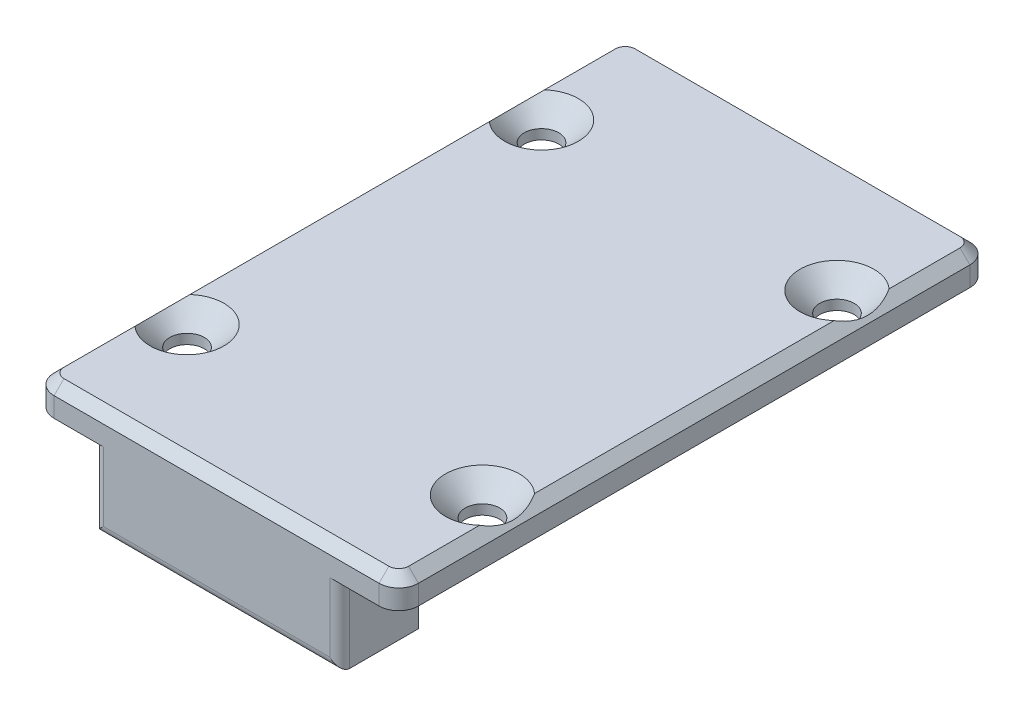
ISO-10303-21;
HEADER;
FILE_DESCRIPTION(('STEP AP214'),'2;1');
FILE_NAME('part.step','',(''),(''),'','','');
FILE_SCHEMA(('AUTOMOTIVE_DESIGN { 1 0 10303 214 1 1 1 1 }'));
ENDSEC;
DATA;
#1=APPLICATION_CONTEXT('core data for automotive mechanical design processes');
#2=APPLICATION_PROTOCOL_DEFINITION('international standard','automotive_design',2000,#1);
#3=PRODUCT_CONTEXT('',#1,'mechanical');
#4=PRODUCT('Part','Part','',(#3));
#5=PRODUCT_RELATED_PRODUCT_CATEGORY('part','',(#4));
#6=PRODUCT_DEFINITION_FORMATION('','',#4);
#7=PRODUCT_DEFINITION_CONTEXT('part definition',#1,'design');
#8=PRODUCT_DEFINITION('design','',#6,#7);
#9=PRODUCT_DEFINITION_SHAPE('','',#8);
#10=(LENGTH_UNIT() NAMED_UNIT(*) SI_UNIT(.MILLI.,.METRE.));
#11=(NAMED_UNIT(*) PLANE_ANGLE_UNIT() SI_UNIT($,.RADIAN.));
#12=(NAMED_UNIT(*) SI_UNIT($,.STERADIAN.) SOLID_ANGLE_UNIT());
#13=UNCERTAINTY_MEASURE_WITH_UNIT(LENGTH_MEASURE(1.E-05),#10,'distance_accuracy_value','');
#14=(GEOMETRIC_REPRESENTATION_CONTEXT(3) GLOBAL_UNCERTAINTY_ASSIGNED_CONTEXT((#13)) GLOBAL_UNIT_ASSIGNED_CONTEXT((#10,
#11,#12)) REPRESENTATION_CONTEXT('',''));
#15=CARTESIAN_POINT('',(0.,0.,0.));
#16=DIRECTION('',(0.,0.,1.));
#17=DIRECTION('',(1.,0.,0.));
#18=AXIS2_PLACEMENT_3D('',#15,#16,#17);
#19=CARTESIAN_POINT('',(18.5,3.,30.));
#20=DIRECTION('',(-1.,0.,0.));
#21=DIRECTION('',(0.,0.,1.));
#22=AXIS2_PLACEMENT_3D('',#19,#20,#21);
#23=PLANE('',#22);
#24=DIRECTION('',(0.,-1.,0.));
#25=VECTOR('',#24,1.);
#26=CARTESIAN_POINT('',(18.5,3.,-28.));
#27=LINE('',#26,#25);
#28=CARTESIAN_POINT('',(18.5,0.,-28.));
#29=VERTEX_POINT('',#28);
#30=CARTESIAN_POINT('',(18.5,1.99999999999999,-28.));
#31=VERTEX_POINT('',#30);
#32=EDGE_CURVE('E267',#29,#31,#27,.F.);
#33=ORIENTED_EDGE('',*,*,#32,.T.);
#34=DIRECTION('',(0.,0.,1.));
#35=VECTOR('',#34,1.);
#36=CARTESIAN_POINT('',(18.5,1.99999999999999,30.));
#37=LINE('',#36,#35);
#38=CARTESIAN_POINT('',(18.5,1.99999999999999,28.));
#39=VERTEX_POINT('',#38);
#40=EDGE_CURVE('E341',#31,#39,#37,.T.);
#41=ORIENTED_EDGE('',*,*,#40,.T.);
#42=DIRECTION('',(0.,-1.,0.));
#43=VECTOR('',#42,1.);
#44=CARTESIAN_POINT('',(18.5,3.,28.));
#45=LINE('',#44,#43);
#46=CARTESIAN_POINT('',(18.5,0.,28.));
#47=VERTEX_POINT('',#46);
#48=EDGE_CURVE('E265',#39,#47,#45,.T.);
#49=ORIENTED_EDGE('',*,*,#48,.T.);
#50=DIRECTION('',(0.,0.,-1.));
#51=VECTOR('',#50,1.);
#52=CARTESIAN_POINT('',(18.5,0.,30.));
#53=LINE('',#52,#51);
#54=EDGE_CURVE('E239',#47,#29,#53,.T.);
#55=ORIENTED_EDGE('',*,*,#54,.T.);
#56=EDGE_LOOP('',(#33,#41,#49,#55));
#57=FACE_BOUND('',#56,.T.);
#58=ADVANCED_FACE('F39',(#57),#23,.F.);
#59=CARTESIAN_POINT('',(-18.5,3.,-30.));
#60=DIRECTION('',(0.,0.,1.));
#61=DIRECTION('',(1.,0.,0.));
#62=AXIS2_PLACEMENT_3D('',#59,#60,#61);
#63=PLANE('',#62);
#64=DIRECTION('',(0.,-1.,0.));
#65=VECTOR('',#64,1.);
#66=CARTESIAN_POINT('',(-16.5,3.,-30.));
#67=LINE('',#66,#65);
#68=CARTESIAN_POINT('',(-16.5,0.,-30.));
#69=VERTEX_POINT('',#68);
#70=CARTESIAN_POINT('',(-16.5,1.99999999999999,-30.));
#71=VERTEX_POINT('',#70);
#72=EDGE_CURVE('E251',#69,#71,#67,.F.);
#73=ORIENTED_EDGE('',*,*,#72,.T.);
#74=DIRECTION('',(1.,0.,0.));
#75=VECTOR('',#74,1.);
#76=CARTESIAN_POINT('',(-18.5,2.,-30.));
#77=LINE('',#76,#75);
#78=CARTESIAN_POINT('',(16.5,1.99999999999999,-30.));
#79=VERTEX_POINT('',#78);
#80=EDGE_CURVE('E326',#71,#79,#77,.T.);
#81=ORIENTED_EDGE('',*,*,#80,.T.);
#82=DIRECTION('',(0.,-1.,0.));
#83=VECTOR('',#82,1.);
#84=CARTESIAN_POINT('',(16.5,3.,-30.));
#85=LINE('',#84,#83);
#86=CARTESIAN_POINT('',(16.5,0.,-30.));
#87=VERTEX_POINT('',#86);
#88=EDGE_CURVE('E254',#79,#87,#85,.T.);
#89=ORIENTED_EDGE('',*,*,#88,.T.);
#90=DIRECTION('',(-1.,0.,0.));
#91=VECTOR('',#90,1.);
#92=CARTESIAN_POINT('',(-18.5,0.,-30.));
#93=LINE('',#92,#91);
#94=EDGE_CURVE('E242',#87,#69,#93,.T.);
#95=ORIENTED_EDGE('',*,*,#94,.T.);
#96=EDGE_LOOP('',(#73,#81,#89,#95));
#97=FACE_BOUND('',#96,.T.);
#98=ADVANCED_FACE('F463',(#97),#63,.F.);
#99=CARTESIAN_POINT('',(-18.5,3.,30.));
#100=DIRECTION('',(1.,0.,0.));
#101=DIRECTION('',(0.,0.,-1.));
#102=AXIS2_PLACEMENT_3D('',#99,#100,#101);
#103=PLANE('',#102);
#104=DIRECTION('',(0.,-1.,0.));
#105=VECTOR('',#104,1.);
#106=CARTESIAN_POINT('',(-18.5,3.,28.));
#107=LINE('',#106,#105);
#108=CARTESIAN_POINT('',(-18.5,0.,28.));
#109=VERTEX_POINT('',#108);
#110=CARTESIAN_POINT('',(-18.5,1.99999999999999,28.));
#111=VERTEX_POINT('',#110);
#112=EDGE_CURVE('E270',#109,#111,#107,.F.);
#113=ORIENTED_EDGE('',*,*,#112,.T.);
#114=DIRECTION('',(0.,0.,-1.));
#115=VECTOR('',#114,1.);
#116=CARTESIAN_POINT('',(-18.5,1.99999999999999,30.));
#117=LINE('',#116,#115);
#118=CARTESIAN_POINT('',(-18.5,1.99999999999999,-28.));
#119=VERTEX_POINT('',#118);
#120=EDGE_CURVE('E329',#111,#119,#117,.T.);
#121=ORIENTED_EDGE('',*,*,#120,.T.);
#122=DIRECTION('',(0.,-1.,0.));
#123=VECTOR('',#122,1.);
#124=CARTESIAN_POINT('',(-18.5,3.,-28.));
#125=LINE('',#124,#123);
#126=CARTESIAN_POINT('',(-18.5,0.,-28.));
#127=VERTEX_POINT('',#126);
#128=EDGE_CURVE('E273',#119,#127,#125,.T.);
#129=ORIENTED_EDGE('',*,*,#128,.T.);
#130=DIRECTION('',(0.,0.,1.));
#131=VECTOR('',#130,1.);
#132=CARTESIAN_POINT('',(-18.5,0.,30.));
#133=LINE('',#132,#131);
#134=EDGE_CURVE('E245',#127,#109,#133,.T.);
#135=ORIENTED_EDGE('',*,*,#134,.T.);
#136=EDGE_LOOP('',(#113,#121,#129,#135));
#137=FACE_BOUND('',#136,.T.);
#138=ADVANCED_FACE('F469',(#137),#103,.F.);
#139=CARTESIAN_POINT('',(-18.5,3.,30.));
#140=DIRECTION('',(0.,0.,-1.));
#141=DIRECTION('',(-1.,0.,0.));
#142=AXIS2_PLACEMENT_3D('',#139,#140,#141);
#143=PLANE('',#142);
#144=DIRECTION('',(0.,-1.,0.));
#145=VECTOR('',#144,1.);
#146=CARTESIAN_POINT('',(16.5,3.,30.));
#147=LINE('',#146,#145);
#148=CARTESIAN_POINT('',(16.5,0.,30.));
#149=VERTEX_POINT('',#148);
#150=CARTESIAN_POINT('',(16.5,1.99999999999999,30.));
#151=VERTEX_POINT('',#150);
#152=EDGE_CURVE('E275',#149,#151,#147,.F.);
#153=ORIENTED_EDGE('',*,*,#152,.T.);
#154=DIRECTION('',(-1.,0.,0.));
#155=VECTOR('',#154,1.);
#156=CARTESIAN_POINT('',(-18.5,1.99999999999999,30.));
#157=LINE('',#156,#155);
#158=CARTESIAN_POINT('',(-16.5,1.99999999999999,30.));
#159=VERTEX_POINT('',#158);
#160=EDGE_CURVE('E335',#151,#159,#157,.T.);
#161=ORIENTED_EDGE('',*,*,#160,.T.);
#162=DIRECTION('',(0.,-1.,0.));
#163=VECTOR('',#162,1.);
#164=CARTESIAN_POINT('',(-16.5,3.,30.));
#165=LINE('',#164,#163);
#166=CARTESIAN_POINT('',(-16.5,0.,30.));
#167=VERTEX_POINT('',#166);
#168=EDGE_CURVE('E278',#159,#167,#165,.T.);
#169=ORIENTED_EDGE('',*,*,#168,.T.);
#170=DIRECTION('',(1.,0.,0.));
#171=VECTOR('',#170,1.);
#172=CARTESIAN_POINT('',(-18.5,0.,30.));
#173=LINE('',#172,#171);
#174=CARTESIAN_POINT('',(-11.5,0.,30.));
#175=VERTEX_POINT('',#174);
#176=EDGE_CURVE('E249',#167,#175,#173,.T.);
#177=ORIENTED_EDGE('',*,*,#176,.T.);
#178=DIRECTION('',(0.,1.,0.));
#179=VECTOR('',#178,1.);
#180=CARTESIAN_POINT('',(-11.5,3.,30.));
#181=LINE('',#180,#179);
#182=CARTESIAN_POINT('',(-11.5,-7.,30.));
#183=VERTEX_POINT('',#182);
#184=EDGE_CURVE('E287',#175,#183,#181,.F.);
#185=ORIENTED_EDGE('',*,*,#184,.T.);
#186=DIRECTION('',(-1.,0.,0.));
#187=VECTOR('',#186,1.);
#188=CARTESIAN_POINT('',(-18.5,-7.,30.));
#189=LINE('',#188,#187);
#190=CARTESIAN_POINT('',(11.5,-7.,30.));
#191=VERTEX_POINT('',#190);
#192=EDGE_CURVE('E285',#183,#191,#189,.F.);
#193=ORIENTED_EDGE('',*,*,#192,.T.);
#194=DIRECTION('',(0.,1.,0.));
#195=VECTOR('',#194,1.);
#196=CARTESIAN_POINT('',(11.5,3.,30.));
#197=LINE('',#196,#195);
#198=CARTESIAN_POINT('',(11.5,0.,30.));
#199=VERTEX_POINT('',#198);
#200=EDGE_CURVE('E282',#191,#199,#197,.T.);
#201=ORIENTED_EDGE('',*,*,#200,.T.);
#202=EDGE_CURVE('E248',#199,#149,#173,.T.);
#203=ORIENTED_EDGE('',*,*,#202,.T.);
#204=EDGE_LOOP('',(#153,#161,#169,#177,#185,#193,#201,#203));
#205=FACE_BOUND('',#204,.T.);
#206=ADVANCED_FACE('F542',(#205),#143,.F.);
#207=CARTESIAN_POINT('',(0.,3.,0.));
#208=DIRECTION('',(0.,-1.,0.));
#209=DIRECTION('',(0.,0.,-1.));
#210=AXIS2_PLACEMENT_3D('',#207,#208,#209);
#211=PLANE('',#210);
#212=DIRECTION('',(0.,0.,1.));
#213=VECTOR('',#212,1.);
#214=CARTESIAN_POINT('',(-17.5,3.,0.));
#215=LINE('',#214,#213);
#216=CARTESIAN_POINT('',(-17.5,3.,-15.2049150281253));
#217=VERTEX_POINT('',#216);
#218=CARTESIAN_POINT('',(-17.5,3.,15.2049150281253));
#219=VERTEX_POINT('',#218);
#220=EDGE_CURVE('E321',#217,#219,#215,.T.);
#221=ORIENTED_EDGE('',*,*,#220,.T.);
#222=CARTESIAN_POINT('',(-15.,3.,18.));
#223=DIRECTION('',(0.,-1.,0.));
#224=DIRECTION('',(0.,0.,-1.));
#225=AXIS2_PLACEMENT_3D('',#222,#223,#224);
#226=CIRCLE('',#225,3.75);
#227=CARTESIAN_POINT('',(-17.5,3.,20.7950849718747));
#228=VERTEX_POINT('',#227);
#229=EDGE_CURVE('E375',#219,#228,#226,.T.);
#230=ORIENTED_EDGE('',*,*,#229,.T.);
#231=CARTESIAN_POINT('',(-17.5,3.,28.));
#232=VERTEX_POINT('',#231);
#233=EDGE_CURVE('E316',#228,#232,#215,.T.);
#234=ORIENTED_EDGE('',*,*,#233,.T.);
#235=CARTESIAN_POINT('',(-16.5,3.,28.));
#236=DIRECTION('',(0.,-1.,0.));
#237=DIRECTION('',(0.,0.,-1.));
#238=AXIS2_PLACEMENT_3D('',#235,#236,#237);
#239=CIRCLE('',#238,0.999999999999994);
#240=CARTESIAN_POINT('',(-16.5,3.,29.));
#241=VERTEX_POINT('',#240);
#242=EDGE_CURVE('E314',#232,#241,#239,.F.);
#243=ORIENTED_EDGE('',*,*,#242,.T.);
#244=DIRECTION('',(1.,0.,0.));
#245=VECTOR('',#244,1.);
#246=CARTESIAN_POINT('',(0.,3.,29.));
#247=LINE('',#246,#245);
#248=CARTESIAN_POINT('',(16.5,3.,29.));
#249=VERTEX_POINT('',#248);
#250=EDGE_CURVE('E312',#241,#249,#247,.T.);
#251=ORIENTED_EDGE('',*,*,#250,.T.);
#252=CARTESIAN_POINT('',(16.5,3.,28.));
#253=DIRECTION('',(0.,-1.,0.));
#254=DIRECTION('',(0.,0.,-1.));
#255=AXIS2_PLACEMENT_3D('',#252,#253,#254);
#256=CIRCLE('',#255,0.99999999999999);
#257=CARTESIAN_POINT('',(17.5,3.,28.));
#258=VERTEX_POINT('',#257);
#259=EDGE_CURVE('E310',#249,#258,#256,.F.);
#260=ORIENTED_EDGE('',*,*,#259,.T.);
#261=DIRECTION('',(0.,0.,-1.));
#262=VECTOR('',#261,1.);
#263=CARTESIAN_POINT('',(17.5,3.,0.));
#264=LINE('',#263,#262);
#265=CARTESIAN_POINT('',(17.5,3.,20.7950849718747));
#266=VERTEX_POINT('',#265);
#267=EDGE_CURVE('E304',#258,#266,#264,.T.);
#268=ORIENTED_EDGE('',*,*,#267,.T.);
#269=CARTESIAN_POINT('',(15.,3.,18.));
#270=DIRECTION('',(0.,-1.,0.));
#271=DIRECTION('',(0.,0.,-1.));
#272=AXIS2_PLACEMENT_3D('',#269,#270,#271);
#273=CIRCLE('',#272,3.75);
#274=CARTESIAN_POINT('',(17.5,3.,15.2049150281253));
#275=VERTEX_POINT('',#274);
#276=EDGE_CURVE('E372',#266,#275,#273,.T.);
#277=ORIENTED_EDGE('',*,*,#276,.T.);
#278=CARTESIAN_POINT('',(17.5,3.,-15.2049150281253));
#279=VERTEX_POINT('',#278);
#280=EDGE_CURVE('E308',#275,#279,#264,.T.);
#281=ORIENTED_EDGE('',*,*,#280,.T.);
#282=CARTESIAN_POINT('',(15.,3.,-18.));
#283=DIRECTION('',(0.,-1.,0.));
#284=DIRECTION('',(0.,0.,-1.));
#285=AXIS2_PLACEMENT_3D('',#282,#283,#284);
#286=CIRCLE('',#285,3.75);
#287=CARTESIAN_POINT('',(17.5,3.,-20.7950849718747));
#288=VERTEX_POINT('',#287);
#289=EDGE_CURVE('E367',#279,#288,#286,.T.);
#290=ORIENTED_EDGE('',*,*,#289,.T.);
#291=CARTESIAN_POINT('',(17.5,3.,-28.));
#292=VERTEX_POINT('',#291);
#293=EDGE_CURVE('E297',#288,#292,#264,.T.);
#294=ORIENTED_EDGE('',*,*,#293,.T.);
#295=CARTESIAN_POINT('',(16.5,3.,-28.));
#296=DIRECTION('',(0.,-1.,0.));
#297=DIRECTION('',(0.,0.,-1.));
#298=AXIS2_PLACEMENT_3D('',#295,#296,#297);
#299=CIRCLE('',#298,0.999999999999994);
#300=CARTESIAN_POINT('',(16.5,3.,-29.));
#301=VERTEX_POINT('',#300);
#302=EDGE_CURVE('E307',#292,#301,#299,.F.);
#303=ORIENTED_EDGE('',*,*,#302,.T.);
#304=DIRECTION('',(-1.,0.,0.));
#305=VECTOR('',#304,1.);
#306=CARTESIAN_POINT('',(0.,3.,-29.));
#307=LINE('',#306,#305);
#308=CARTESIAN_POINT('',(-16.5,3.,-29.));
#309=VERTEX_POINT('',#308);
#310=EDGE_CURVE('E320',#301,#309,#307,.T.);
#311=ORIENTED_EDGE('',*,*,#310,.T.);
#312=CARTESIAN_POINT('',(-16.5,3.,-28.));
#313=DIRECTION('',(0.,-1.,0.));
#314=DIRECTION('',(0.,0.,-1.));
#315=AXIS2_PLACEMENT_3D('',#312,#313,#314);
#316=CIRCLE('',#315,0.99999999999999);
#317=CARTESIAN_POINT('',(-17.5,3.,-28.));
#318=VERTEX_POINT('',#317);
#319=EDGE_CURVE('E324',#309,#318,#316,.F.);
#320=ORIENTED_EDGE('',*,*,#319,.T.);
#321=CARTESIAN_POINT('',(-17.5,3.,-20.7950849718747));
#322=VERTEX_POINT('',#321);
#323=EDGE_CURVE('E317',#318,#322,#215,.T.);
#324=ORIENTED_EDGE('',*,*,#323,.T.);
#325=CARTESIAN_POINT('',(-15.,3.,-18.));
#326=DIRECTION('',(0.,-1.,0.));
#327=DIRECTION('',(0.,0.,-1.));
#328=AXIS2_PLACEMENT_3D('',#325,#326,#327);
#329=CIRCLE('',#328,3.75);
#330=EDGE_CURVE('E369',#322,#217,#329,.T.);
#331=ORIENTED_EDGE('',*,*,#330,.T.);
#332=EDGE_LOOP('',(#221,#230,#234,#243,#251,#260,#268,#277,#281,#290,#294,#303,#311,#320,#324,#331));
#333=FACE_BOUND('',#332,.T.);
#334=ADVANCED_FACE('F571',(#333),#211,.F.);
#335=CARTESIAN_POINT('',(0.,0.,0.));
#336=DIRECTION('',(0.,-1.,0.));
#337=DIRECTION('',(0.,0.,-1.));
#338=AXIS2_PLACEMENT_3D('',#335,#336,#337);
#339=PLANE('',#338);
#340=DIRECTION('',(0.,0.,1.));
#341=VECTOR('',#340,1.);
#342=CARTESIAN_POINT('',(12.5,0.,22.));
#343=LINE('',#342,#341);
#344=CARTESIAN_POINT('',(12.5,0.,22.));
#345=VERTEX_POINT('',#344);
#346=CARTESIAN_POINT('',(12.5,0.,29.));
#347=VERTEX_POINT('',#346);
#348=EDGE_CURVE('E221',#345,#347,#343,.T.);
#349=ORIENTED_EDGE('',*,*,#348,.F.);
#350=DIRECTION('',(1.,0.,0.));
#351=VECTOR('',#350,1.);
#352=CARTESIAN_POINT('',(-12.5,0.,22.));
#353=LINE('',#352,#351);
#354=CARTESIAN_POINT('',(-12.5,0.,22.));
#355=VERTEX_POINT('',#354);
#356=EDGE_CURVE('E226',#355,#345,#353,.T.);
#357=ORIENTED_EDGE('',*,*,#356,.F.);
#358=DIRECTION('',(0.,0.,-1.));
#359=VECTOR('',#358,1.);
#360=CARTESIAN_POINT('',(-12.5,0.,22.));
#361=LINE('',#360,#359);
#362=CARTESIAN_POINT('',(-12.5,0.,29.));
#363=VERTEX_POINT('',#362);
#364=EDGE_CURVE('E207',#363,#355,#361,.T.);
#365=ORIENTED_EDGE('',*,*,#364,.F.);
#366=CARTESIAN_POINT('',(-11.5,0.,29.));
#367=DIRECTION('',(0.,-1.,0.));
#368=DIRECTION('',(0.,0.,-1.));
#369=AXIS2_PLACEMENT_3D('',#366,#367,#368);
#370=CIRCLE('',#369,1.);
#371=EDGE_CURVE('E292',#363,#175,#370,.F.);
#372=ORIENTED_EDGE('',*,*,#371,.T.);
#373=ORIENTED_EDGE('',*,*,#176,.F.);
#374=CARTESIAN_POINT('',(-16.5,0.,28.));
#375=DIRECTION('',(0.,-1.,0.));
#376=DIRECTION('',(0.,0.,-1.));
#377=AXIS2_PLACEMENT_3D('',#374,#375,#376);
#378=CIRCLE('',#377,2.);
#379=EDGE_CURVE('E259',#167,#109,#378,.T.);
#380=ORIENTED_EDGE('',*,*,#379,.T.);
#381=ORIENTED_EDGE('',*,*,#134,.F.);
#382=CARTESIAN_POINT('',(-16.5,0.,-28.));
#383=DIRECTION('',(0.,-1.,0.));
#384=DIRECTION('',(0.,0.,-1.));
#385=AXIS2_PLACEMENT_3D('',#382,#383,#384);
#386=CIRCLE('',#385,2.);
#387=EDGE_CURVE('E261',#127,#69,#386,.T.);
#388=ORIENTED_EDGE('',*,*,#387,.T.);
#389=ORIENTED_EDGE('',*,*,#94,.F.);
#390=CARTESIAN_POINT('',(16.5,0.,-28.));
#391=DIRECTION('',(0.,-1.,0.));
#392=DIRECTION('',(0.,0.,-1.));
#393=AXIS2_PLACEMENT_3D('',#390,#391,#392);
#394=CIRCLE('',#393,2.);
#395=EDGE_CURVE('E263',#87,#29,#394,.T.);
#396=ORIENTED_EDGE('',*,*,#395,.T.);
#397=ORIENTED_EDGE('',*,*,#54,.F.);
#398=CARTESIAN_POINT('',(16.5,0.,28.));
#399=DIRECTION('',(0.,-1.,0.));
#400=DIRECTION('',(0.,0.,-1.));
#401=AXIS2_PLACEMENT_3D('',#398,#399,#400);
#402=CIRCLE('',#401,2.);
#403=EDGE_CURVE('E256',#47,#149,#402,.T.);
#404=ORIENTED_EDGE('',*,*,#403,.T.);
#405=ORIENTED_EDGE('',*,*,#202,.F.);
#406=CARTESIAN_POINT('',(11.5,0.,29.));
#407=DIRECTION('',(0.,-1.,0.));
#408=DIRECTION('',(0.,0.,-1.));
#409=AXIS2_PLACEMENT_3D('',#406,#407,#408);
#410=CIRCLE('',#409,1.);
#411=EDGE_CURVE('E295',#199,#347,#410,.F.);
#412=ORIENTED_EDGE('',*,*,#411,.T.);
#413=EDGE_LOOP('',(#349,#357,#365,#372,#373,#380,#381,#388,#389,#396,#397,#404,#405,#412));
#414=FACE_BOUND('',#413,.T.);
#415=CARTESIAN_POINT('',(-15.,0.,-18.));
#416=DIRECTION('',(0.,1.,0.));
#417=DIRECTION('',(0.,0.,-1.));
#418=AXIS2_PLACEMENT_3D('',#415,#416,#417);
#419=CIRCLE('',#418,1.75);
#420=CARTESIAN_POINT('',(-15.,0.,-19.75));
#421=VERTEX_POINT('',#420);
#422=EDGE_CURVE('E211',#421,#421,#419,.T.);
#423=ORIENTED_EDGE('',*,*,#422,.T.);
#424=EDGE_LOOP('',(#423));
#425=FACE_BOUND('',#424,.T.);
#426=CARTESIAN_POINT('',(-15.,0.,18.));
#427=DIRECTION('',(0.,1.,0.));
#428=DIRECTION('',(0.,0.,1.));
#429=AXIS2_PLACEMENT_3D('',#426,#427,#428);
#430=CIRCLE('',#429,1.75);
#431=CARTESIAN_POINT('',(-15.,0.,19.75));
#432=VERTEX_POINT('',#431);
#433=EDGE_CURVE('E232',#432,#432,#430,.T.);
#434=ORIENTED_EDGE('',*,*,#433,.T.);
#435=EDGE_LOOP('',(#434));
#436=FACE_BOUND('',#435,.T.);
#437=CARTESIAN_POINT('',(15.,0.,18.));
#438=DIRECTION('',(0.,1.,0.));
#439=DIRECTION('',(0.,0.,-1.));
#440=AXIS2_PLACEMENT_3D('',#437,#438,#439);
#441=CIRCLE('',#440,1.75);
#442=CARTESIAN_POINT('',(15.,0.,16.25));
#443=VERTEX_POINT('',#442);
#444=EDGE_CURVE('E228',#443,#443,#441,.T.);
#445=ORIENTED_EDGE('',*,*,#444,.T.);
#446=EDGE_LOOP('',(#445));
#447=FACE_BOUND('',#446,.T.);
#448=CARTESIAN_POINT('',(15.,0.,-18.));
#449=DIRECTION('',(0.,1.,0.));
#450=DIRECTION('',(0.,0.,1.));
#451=AXIS2_PLACEMENT_3D('',#448,#449,#450);
#452=CIRCLE('',#451,1.75);
#453=CARTESIAN_POINT('',(15.,0.,-16.25));
#454=VERTEX_POINT('',#453);
#455=EDGE_CURVE('E231',#454,#454,#452,.T.);
#456=ORIENTED_EDGE('',*,*,#455,.T.);
#457=EDGE_LOOP('',(#456));
#458=FACE_BOUND('',#457,.T.);
#459=ADVANCED_FACE('F548',(#414,#425,#436,#447,#458),#339,.T.);
#460=CARTESIAN_POINT('',(15.,0.,-18.));
#461=DIRECTION('',(0.,1.,0.));
#462=DIRECTION('',(0.,0.,1.));
#463=AXIS2_PLACEMENT_3D('',#460,#461,#462);
#464=CYLINDRICAL_SURFACE('',#463,1.75);
#465=CARTESIAN_POINT('',(15.,0.999999999999994,-18.));
#466=DIRECTION('',(0.,-1.,0.));
#467=DIRECTION('',(0.,0.,-1.));
#468=AXIS2_PLACEMENT_3D('',#465,#466,#467);
#469=CIRCLE('',#468,1.75);
#470=CARTESIAN_POINT('',(15.,0.999999999999994,-19.75));
#471=VERTEX_POINT('',#470);
#472=EDGE_CURVE('E11',#471,#471,#469,.F.);
#473=ORIENTED_EDGE('',*,*,#472,.T.);
#474=EDGE_LOOP('',(#473));
#475=FACE_BOUND('',#474,.T.);
#476=ORIENTED_EDGE('',*,*,#455,.F.);
#477=EDGE_LOOP('',(#476));
#478=FACE_BOUND('',#477,.T.);
#479=ADVANCED_FACE('F577',(#475,#478),#464,.F.);
#480=CARTESIAN_POINT('',(15.,0.,18.));
#481=DIRECTION('',(0.,1.,0.));
#482=DIRECTION('',(0.,0.,1.));
#483=AXIS2_PLACEMENT_3D('',#480,#481,#482);
#484=CYLINDRICAL_SURFACE('',#483,1.75);
#485=CARTESIAN_POINT('',(15.,0.999999999999994,18.));
#486=DIRECTION('',(0.,-1.,0.));
#487=DIRECTION('',(0.,0.,-1.));
#488=AXIS2_PLACEMENT_3D('',#485,#486,#487);
#489=CIRCLE('',#488,1.75);
#490=CARTESIAN_POINT('',(15.,0.999999999999994,16.25));
#491=VERTEX_POINT('',#490);
#492=EDGE_CURVE('E805',#491,#491,#489,.F.);
#493=ORIENTED_EDGE('',*,*,#492,.T.);
#494=EDGE_LOOP('',(#493));
#495=FACE_BOUND('',#494,.T.);
#496=ORIENTED_EDGE('',*,*,#444,.F.);
#497=EDGE_LOOP('',(#496));
#498=FACE_BOUND('',#497,.T.);
#499=ADVANCED_FACE('F580',(#495,#498),#484,.F.);
#500=CARTESIAN_POINT('',(-15.,0.,18.));
#501=DIRECTION('',(0.,1.,0.));
#502=DIRECTION('',(0.,0.,1.));
#503=AXIS2_PLACEMENT_3D('',#500,#501,#502);
#504=CYLINDRICAL_SURFACE('',#503,1.75);
#505=CARTESIAN_POINT('',(-15.,0.999999999999999,18.));
#506=DIRECTION('',(0.,-1.,0.));
#507=DIRECTION('',(0.,0.,-1.));
#508=AXIS2_PLACEMENT_3D('',#505,#506,#507);
#509=CIRCLE('',#508,1.75);
#510=CARTESIAN_POINT('',(-15.,0.999999999999999,16.25));
#511=VERTEX_POINT('',#510);
#512=EDGE_CURVE('E343',#511,#511,#509,.F.);
#513=ORIENTED_EDGE('',*,*,#512,.T.);
#514=EDGE_LOOP('',(#513));
#515=FACE_BOUND('',#514,.T.);
#516=ORIENTED_EDGE('',*,*,#433,.F.);
#517=EDGE_LOOP('',(#516));
#518=FACE_BOUND('',#517,.T.);
#519=ADVANCED_FACE('F609',(#515,#518),#504,.F.);
#520=CARTESIAN_POINT('',(-15.,0.,-18.));
#521=DIRECTION('',(0.,1.,0.));
#522=DIRECTION('',(0.,0.,1.));
#523=AXIS2_PLACEMENT_3D('',#520,#521,#522);
#524=CYLINDRICAL_SURFACE('',#523,1.75);
#525=CARTESIAN_POINT('',(-15.,0.999999999999999,-18.));
#526=DIRECTION('',(0.,-1.,0.));
#527=DIRECTION('',(0.,0.,-1.));
#528=AXIS2_PLACEMENT_3D('',#525,#526,#527);
#529=CIRCLE('',#528,1.75);
#530=CARTESIAN_POINT('',(-15.,0.999999999999999,-19.75));
#531=VERTEX_POINT('',#530);
#532=EDGE_CURVE('E49',#531,#531,#529,.F.);
#533=ORIENTED_EDGE('',*,*,#532,.T.);
#534=EDGE_LOOP('',(#533));
#535=FACE_BOUND('',#534,.T.);
#536=ORIENTED_EDGE('',*,*,#422,.F.);
#537=EDGE_LOOP('',(#536));
#538=FACE_BOUND('',#537,.T.);
#539=ADVANCED_FACE('F478',(#535,#538),#524,.F.);
#540=CARTESIAN_POINT('',(16.5,3.,-28.));
#541=DIRECTION('',(0.,-1.,0.));
#542=DIRECTION('',(0.,0.,-1.));
#543=AXIS2_PLACEMENT_3D('',#540,#541,#542);
#544=CYLINDRICAL_SURFACE('',#543,2.);
#545=ORIENTED_EDGE('',*,*,#88,.F.);
#546=CARTESIAN_POINT('',(16.5,1.99999999999999,-28.));
#547=DIRECTION('',(0.,-1.,0.));
#548=DIRECTION('',(0.,0.,-1.));
#549=AXIS2_PLACEMENT_3D('',#546,#547,#548);
#550=CIRCLE('',#549,2.);
#551=EDGE_CURVE('E339',#79,#31,#550,.T.);
#552=ORIENTED_EDGE('',*,*,#551,.T.);
#553=ORIENTED_EDGE('',*,*,#32,.F.);
#554=ORIENTED_EDGE('',*,*,#395,.F.);
#555=EDGE_LOOP('',(#545,#552,#553,#554));
#556=FACE_BOUND('',#555,.T.);
#557=ADVANCED_FACE('F474',(#556),#544,.T.);
#558=CARTESIAN_POINT('',(-16.5,3.,-28.));
#559=DIRECTION('',(0.,-1.,0.));
#560=DIRECTION('',(0.,0.,-1.));
#561=AXIS2_PLACEMENT_3D('',#558,#559,#560);
#562=CYLINDRICAL_SURFACE('',#561,2.);
#563=ORIENTED_EDGE('',*,*,#128,.F.);
#564=CARTESIAN_POINT('',(-16.5,1.99999999999999,-28.));
#565=DIRECTION('',(0.,-1.,0.));
#566=DIRECTION('',(0.,0.,-1.));
#567=AXIS2_PLACEMENT_3D('',#564,#565,#566);
#568=CIRCLE('',#567,2.);
#569=EDGE_CURVE('E333',#119,#71,#568,.T.);
#570=ORIENTED_EDGE('',*,*,#569,.T.);
#571=ORIENTED_EDGE('',*,*,#72,.F.);
#572=ORIENTED_EDGE('',*,*,#387,.F.);
#573=EDGE_LOOP('',(#563,#570,#571,#572));
#574=FACE_BOUND('',#573,.T.);
#575=ADVANCED_FACE('F477',(#574),#562,.T.);
#576=CARTESIAN_POINT('',(-16.5,3.,28.));
#577=DIRECTION('',(0.,-1.,0.));
#578=DIRECTION('',(0.,0.,-1.));
#579=AXIS2_PLACEMENT_3D('',#576,#577,#578);
#580=CYLINDRICAL_SURFACE('',#579,2.);
#581=ORIENTED_EDGE('',*,*,#168,.F.);
#582=CARTESIAN_POINT('',(-16.5,1.99999999999999,28.));
#583=DIRECTION('',(0.,-1.,0.));
#584=DIRECTION('',(0.,0.,-1.));
#585=AXIS2_PLACEMENT_3D('',#582,#583,#584);
#586=CIRCLE('',#585,2.);
#587=EDGE_CURVE('E331',#159,#111,#586,.T.);
#588=ORIENTED_EDGE('',*,*,#587,.T.);
#589=ORIENTED_EDGE('',*,*,#112,.F.);
#590=ORIENTED_EDGE('',*,*,#379,.F.);
#591=EDGE_LOOP('',(#581,#588,#589,#590));
#592=FACE_BOUND('',#591,.T.);
#593=ADVANCED_FACE('F482',(#592),#580,.T.);
#594=CARTESIAN_POINT('',(16.5,3.,28.));
#595=DIRECTION('',(0.,-1.,0.));
#596=DIRECTION('',(0.,0.,-1.));
#597=AXIS2_PLACEMENT_3D('',#594,#595,#596);
#598=CYLINDRICAL_SURFACE('',#597,2.);
#599=ORIENTED_EDGE('',*,*,#48,.F.);
#600=CARTESIAN_POINT('',(16.5,1.99999999999999,28.));
#601=DIRECTION('',(0.,-1.,0.));
#602=DIRECTION('',(0.,0.,-1.));
#603=AXIS2_PLACEMENT_3D('',#600,#601,#602);
#604=CIRCLE('',#603,2.);
#605=EDGE_CURVE('E337',#39,#151,#604,.T.);
#606=ORIENTED_EDGE('',*,*,#605,.T.);
#607=ORIENTED_EDGE('',*,*,#152,.F.);
#608=ORIENTED_EDGE('',*,*,#403,.F.);
#609=EDGE_LOOP('',(#599,#606,#607,#608));
#610=FACE_BOUND('',#609,.T.);
#611=ADVANCED_FACE('F486',(#610),#598,.T.);
#612=CARTESIAN_POINT('',(12.5,-8.,22.));
#613=DIRECTION('',(-1.,0.,0.));
#614=DIRECTION('',(0.,0.,1.));
#615=AXIS2_PLACEMENT_3D('',#612,#613,#614);
#616=PLANE('',#615);
#617=ORIENTED_EDGE('',*,*,#348,.T.);
#618=DIRECTION('',(0.,1.,0.));
#619=VECTOR('',#618,1.);
#620=CARTESIAN_POINT('',(12.5,-8.,29.));
#621=LINE('',#620,#619);
#622=CARTESIAN_POINT('',(12.5,-8.,29.));
#623=VERTEX_POINT('',#622);
#624=EDGE_CURVE('E290',#347,#623,#621,.F.);
#625=ORIENTED_EDGE('',*,*,#624,.T.);
#626=DIRECTION('',(0.,0.,1.));
#627=VECTOR('',#626,1.);
#628=CARTESIAN_POINT('',(12.5,-8.,22.));
#629=LINE('',#628,#627);
#630=CARTESIAN_POINT('',(12.5,-8.,22.));
#631=VERTEX_POINT('',#630);
#632=EDGE_CURVE('E201',#631,#623,#629,.T.);
#633=ORIENTED_EDGE('',*,*,#632,.F.);
#634=DIRECTION('',(0.,1.,0.));
#635=VECTOR('',#634,1.);
#636=CARTESIAN_POINT('',(12.5,-8.,22.));
#637=LINE('',#636,#635);
#638=EDGE_CURVE('E212',#631,#345,#637,.T.);
#639=ORIENTED_EDGE('',*,*,#638,.T.);
#640=EDGE_LOOP('',(#617,#625,#633,#639));
#641=FACE_BOUND('',#640,.T.);
#642=ADVANCED_FACE('F489',(#641),#616,.F.);
#643=CARTESIAN_POINT('',(-12.5,-8.,22.));
#644=DIRECTION('',(1.,0.,0.));
#645=DIRECTION('',(0.,0.,-1.));
#646=AXIS2_PLACEMENT_3D('',#643,#644,#645);
#647=PLANE('',#646);
#648=DIRECTION('',(0.,0.,-1.));
#649=VECTOR('',#648,1.);
#650=CARTESIAN_POINT('',(-12.5,-8.,22.));
#651=LINE('',#650,#649);
#652=CARTESIAN_POINT('',(-12.5,-8.,29.));
#653=VERTEX_POINT('',#652);
#654=CARTESIAN_POINT('',(-12.5,-8.,22.));
#655=VERTEX_POINT('',#654);
#656=EDGE_CURVE('E189',#653,#655,#651,.T.);
#657=ORIENTED_EDGE('',*,*,#656,.F.);
#658=DIRECTION('',(0.,1.,0.));
#659=VECTOR('',#658,1.);
#660=CARTESIAN_POINT('',(-12.5,-8.,29.));
#661=LINE('',#660,#659);
#662=EDGE_CURVE('E280',#653,#363,#661,.T.);
#663=ORIENTED_EDGE('',*,*,#662,.T.);
#664=ORIENTED_EDGE('',*,*,#364,.T.);
#665=DIRECTION('',(0.,1.,0.));
#666=VECTOR('',#665,1.);
#667=CARTESIAN_POINT('',(-12.5,-8.,22.));
#668=LINE('',#667,#666);
#669=EDGE_CURVE('E204',#655,#355,#668,.T.);
#670=ORIENTED_EDGE('',*,*,#669,.F.);
#671=EDGE_LOOP('',(#657,#663,#664,#670));
#672=FACE_BOUND('',#671,.T.);
#673=ADVANCED_FACE('F205',(#672),#647,.F.);
#674=CARTESIAN_POINT('',(-12.5,-8.,22.));
#675=DIRECTION('',(0.,0.,1.));
#676=DIRECTION('',(1.,0.,0.));
#677=AXIS2_PLACEMENT_3D('',#674,#675,#676);
#678=PLANE('',#677);
#679=ORIENTED_EDGE('',*,*,#356,.T.);
#680=ORIENTED_EDGE('',*,*,#638,.F.);
#681=DIRECTION('',(1.,0.,0.));
#682=VECTOR('',#681,1.);
#683=CARTESIAN_POINT('',(-12.5,-8.,22.));
#684=LINE('',#683,#682);
#685=EDGE_CURVE('E194',#655,#631,#684,.T.);
#686=ORIENTED_EDGE('',*,*,#685,.F.);
#687=ORIENTED_EDGE('',*,*,#669,.T.);
#688=EDGE_LOOP('',(#679,#680,#686,#687));
#689=FACE_BOUND('',#688,.T.);
#690=ADVANCED_FACE('F214',(#689),#678,.F.);
#691=CARTESIAN_POINT('',(0.,-8.,0.));
#692=DIRECTION('',(0.,1.,0.));
#693=DIRECTION('',(0.,0.,1.));
#694=AXIS2_PLACEMENT_3D('',#691,#692,#693);
#695=PLANE('',#694);
#696=ORIENTED_EDGE('',*,*,#632,.T.);
#697=DIRECTION('',(-1.,0.,0.));
#698=VECTOR('',#697,1.);
#699=CARTESIAN_POINT('',(0.,-8.,29.));
#700=LINE('',#699,#698);
#701=EDGE_CURVE('E197',#623,#653,#700,.T.);
#702=ORIENTED_EDGE('',*,*,#701,.T.);
#703=ORIENTED_EDGE('',*,*,#656,.T.);
#704=ORIENTED_EDGE('',*,*,#685,.T.);
#705=EDGE_LOOP('',(#696,#702,#703,#704));
#706=FACE_BOUND('',#705,.T.);
#707=ADVANCED_FACE('F192',(#706),#695,.F.);
#708=CARTESIAN_POINT('',(11.5,3.,29.));
#709=DIRECTION('',(0.,1.,0.));
#710=DIRECTION('',(0.,0.,1.));
#711=AXIS2_PLACEMENT_3D('',#708,#709,#710);
#712=CYLINDRICAL_SURFACE('',#711,1.);
#713=ORIENTED_EDGE('',*,*,#411,.F.);
#714=ORIENTED_EDGE('',*,*,#200,.F.);
#715=CARTESIAN_POINT('',(11.5,-7.,29.));
#716=DIRECTION('',(0.707106781186547,0.707106781186547,0.));
#717=DIRECTION('',(-0.707106781186547,0.707106781186547,0.));
#718=AXIS2_PLACEMENT_3D('',#715,#716,#717);
#719=ELLIPSE('',#718,1.41421356237309,1.);
#720=EDGE_CURVE('E224',#623,#191,#719,.F.);
#721=ORIENTED_EDGE('',*,*,#720,.F.);
#722=ORIENTED_EDGE('',*,*,#624,.F.);
#723=EDGE_LOOP('',(#713,#714,#721,#722));
#724=FACE_BOUND('',#723,.T.);
#725=ADVANCED_FACE('F494',(#724),#712,.T.);
#726=CARTESIAN_POINT('',(0.,-7.,29.));
#727=DIRECTION('',(-1.,0.,0.));
#728=DIRECTION('',(0.,0.,1.));
#729=AXIS2_PLACEMENT_3D('',#726,#727,#728);
#730=CYLINDRICAL_SURFACE('',#729,1.);
#731=ORIENTED_EDGE('',*,*,#720,.T.);
#732=ORIENTED_EDGE('',*,*,#192,.F.);
#733=CARTESIAN_POINT('',(-11.5,-7.,29.));
#734=DIRECTION('',(-0.707106781186547,0.707106781186547,0.));
#735=DIRECTION('',(-0.707106781186547,-0.707106781186547,0.));
#736=AXIS2_PLACEMENT_3D('',#733,#734,#735);
#737=ELLIPSE('',#736,1.41421356237309,1.);
#738=EDGE_CURVE('E298',#653,#183,#737,.T.);
#739=ORIENTED_EDGE('',*,*,#738,.F.);
#740=ORIENTED_EDGE('',*,*,#701,.F.);
#741=EDGE_LOOP('',(#731,#732,#739,#740));
#742=FACE_BOUND('',#741,.T.);
#743=ADVANCED_FACE('F458',(#742),#730,.T.);
#744=CARTESIAN_POINT('',(-11.5,-8.,29.));
#745=DIRECTION('',(0.,1.,0.));
#746=DIRECTION('',(0.,0.,1.));
#747=AXIS2_PLACEMENT_3D('',#744,#745,#746);
#748=CYLINDRICAL_SURFACE('',#747,1.);
#749=ORIENTED_EDGE('',*,*,#738,.T.);
#750=ORIENTED_EDGE('',*,*,#184,.F.);
#751=ORIENTED_EDGE('',*,*,#371,.F.);
#752=ORIENTED_EDGE('',*,*,#662,.F.);
#753=EDGE_LOOP('',(#749,#750,#751,#752));
#754=FACE_BOUND('',#753,.T.);
#755=ADVANCED_FACE('F453',(#754),#748,.T.);
#756=CARTESIAN_POINT('',(0.,3.,29.));
#757=DIRECTION('',(0.,-0.707106781186547,-0.707106781186547));
#758=DIRECTION('',(1.,0.,0.));
#759=AXIS2_PLACEMENT_3D('',#756,#757,#758);
#760=PLANE('',#759);
#761=DIRECTION('',(0.,0.707106781186547,-0.707106781186547));
#762=VECTOR('',#761,1.);
#763=CARTESIAN_POINT('',(-16.5,1.99999999999999,30.));
#764=LINE('',#763,#762);
#765=EDGE_CURVE('E360',#159,#241,#764,.T.);
#766=ORIENTED_EDGE('',*,*,#765,.F.);
#767=ORIENTED_EDGE('',*,*,#160,.F.);
#768=DIRECTION('',(0.,-0.707106781186547,0.707106781186547));
#769=VECTOR('',#768,1.);
#770=CARTESIAN_POINT('',(16.5,3.,29.));
#771=LINE('',#770,#769);
#772=EDGE_CURVE('E301',#249,#151,#771,.T.);
#773=ORIENTED_EDGE('',*,*,#772,.F.);
#774=ORIENTED_EDGE('',*,*,#250,.F.);
#775=EDGE_LOOP('',(#766,#767,#773,#774));
#776=FACE_BOUND('',#775,.T.);
#777=ADVANCED_FACE('F448',(#776),#760,.F.);
#778=CARTESIAN_POINT('',(16.5,3.,28.));
#779=DIRECTION('',(0.,-1.,0.));
#780=DIRECTION('',(0.,0.,-1.));
#781=AXIS2_PLACEMENT_3D('',#778,#779,#780);
#782=CONICAL_SURFACE('',#781,0.99999999999999,0.785398163397449);
#783=ORIENTED_EDGE('',*,*,#772,.T.);
#784=ORIENTED_EDGE('',*,*,#605,.F.);
#785=DIRECTION('',(0.707106781186547,-0.707106781186547,0.));
#786=VECTOR('',#785,1.);
#787=CARTESIAN_POINT('',(17.5,3.,28.));
#788=LINE('',#787,#786);
#789=EDGE_CURVE('E357',#258,#39,#788,.T.);
#790=ORIENTED_EDGE('',*,*,#789,.F.);
#791=ORIENTED_EDGE('',*,*,#259,.F.);
#792=EDGE_LOOP('',(#783,#784,#790,#791));
#793=FACE_BOUND('',#792,.T.);
#794=ADVANCED_FACE('F442',(#793),#782,.T.);
#795=CARTESIAN_POINT('',(-16.5,3.,28.));
#796=DIRECTION('',(0.,-1.,0.));
#797=DIRECTION('',(0.,0.,-1.));
#798=AXIS2_PLACEMENT_3D('',#795,#796,#797);
#799=CONICAL_SURFACE('',#798,0.999999999999994,0.785398163397447);
#800=ORIENTED_EDGE('',*,*,#765,.T.);
#801=ORIENTED_EDGE('',*,*,#242,.F.);
#802=DIRECTION('',(0.707106781186546,0.707106781186549,0.));
#803=VECTOR('',#802,1.);
#804=CARTESIAN_POINT('',(-18.5,1.99999999999999,28.));
#805=LINE('',#804,#803);
#806=EDGE_CURVE('E354',#111,#232,#805,.T.);
#807=ORIENTED_EDGE('',*,*,#806,.F.);
#808=ORIENTED_EDGE('',*,*,#587,.F.);
#809=EDGE_LOOP('',(#800,#801,#807,#808));
#810=FACE_BOUND('',#809,.T.);
#811=ADVANCED_FACE('F435',(#810),#799,.T.);
#812=CARTESIAN_POINT('',(17.5,3.,0.));
#813=DIRECTION('',(-0.707106781186547,-0.707106781186547,0.));
#814=DIRECTION('',(0.,0.,-1.));
#815=AXIS2_PLACEMENT_3D('',#812,#813,#814);
#816=PLANE('',#815);
#817=ORIENTED_EDGE('',*,*,#280,.F.);
#818=CARTESIAN_POINT('',(17.5,3.,15.2049150281253));
#819=CARTESIAN_POINT('',(17.5674438012258,2.9325561987742,15.3557160416459));
#820=CARTESIAN_POINT('',(17.631052433273,2.86894756672696,15.5101619667175));
#821=CARTESIAN_POINT('',(17.7490957963741,2.7509042036259,15.8265457960376));
#822=CARTESIAN_POINT('',(17.8034990433458,2.69650095665419,15.9885070904786));
#823=CARTESIAN_POINT('',(17.9012783170305,2.59872168296947,16.3195332562691));
#824=CARTESIAN_POINT('',(17.9446256105106,2.55537438948944,16.4886153329003));
#825=CARTESIAN_POINT('',(18.0182526455055,2.48174735449448,16.8321975132897));
#826=CARTESIAN_POINT('',(18.0485515202423,2.45144847975767,17.0066892791378));
#827=CARTESIAN_POINT('',(18.0880093273918,2.41199067260816,17.3085126144753));
#828=CARTESIAN_POINT('',(18.1007455650752,2.39925443492479,17.4349225243938));
#829=CARTESIAN_POINT('',(18.1185406474048,2.38145935259523,17.6888099966311));
#830=CARTESIAN_POINT('',(18.123601133785,2.37639886621499,17.8162873247775));
#831=CARTESIAN_POINT('',(18.1258897721441,2.37411022785586,18.0708961919813));
#832=CARTESIAN_POINT('',(18.1231475908511,2.37685240914891,18.1980272061076));
#833=CARTESIAN_POINT('',(18.1099779081874,2.39002209181256,18.4514822426427));
#834=CARTESIAN_POINT('',(18.0995506048363,2.40044939516369,18.57780628576));
#835=CARTESIAN_POINT('',(18.0713544654084,2.42864553459159,18.8283848012141));
#836=CARTESIAN_POINT('',(18.0536088335603,2.44639116643972,18.9526445349372));
#837=CARTESIAN_POINT('',(18.0112439099576,2.48875609004235,19.1987925226512));
#838=CARTESIAN_POINT('',(17.986624084367,2.51337591563303,19.3206805916767));
#839=CARTESIAN_POINT('',(17.9310195990327,2.56898040096729,19.5618370628182));
#840=CARTESIAN_POINT('',(17.9000191637837,2.59998083621624,19.6810981450188));
#841=CARTESIAN_POINT('',(17.8323168123694,2.66768318763061,19.9163454747485));
#842=CARTESIAN_POINT('',(17.7956139314377,2.70438606856233,20.0323311642004));
#843=CARTESIAN_POINT('',(17.718004219565,2.78199578043499,20.2583042453476));
#844=CARTESIAN_POINT('',(17.6772068481879,2.82279315181208,20.3683673385301));
#845=CARTESIAN_POINT('',(17.5915424247614,2.90845757523859,20.5845377238416));
#846=CARTESIAN_POINT('',(17.5466975302815,2.95330246971849,20.6906625424369));
#847=CARTESIAN_POINT('',(17.5,3.,20.7950849718747));
#848=B_SPLINE_CURVE_WITH_KNOTS('',3,(#818,#819,#820,#821,#822,#823,#824,#825,#826,#827,#828,
#829,#830,#831,#832,#833,#834,#835,#836,#837,#838,#839,#840,#841,#842,#843,#844,#845,#846,#847),
.UNSPECIFIED.,.F.,.F.,(4,2,2,2,2,2,2,2,2,2,2,2,2,2,4),(0.,0.535454386988254,1.07270464697343,
1.61133725320127,2.14917733732442,2.53181002989533,2.91436087122907,3.295459151683,
3.67654761287301,4.05643693493286,4.43635576664924,4.81722544809296,5.19815963715081,
5.57076513633807,5.94144203767761),.UNSPECIFIED.);
#849=EDGE_CURVE('E417',#275,#266,#848,.T.);
#850=ORIENTED_EDGE('',*,*,#849,.T.);
#851=ORIENTED_EDGE('',*,*,#267,.F.);
#852=ORIENTED_EDGE('',*,*,#789,.T.);
#853=ORIENTED_EDGE('',*,*,#40,.F.);
#854=DIRECTION('',(0.707106781186547,-0.707106781186547,0.));
#855=VECTOR('',#854,1.);
#856=CARTESIAN_POINT('',(17.5,3.,-28.));
#857=LINE('',#856,#855);
#858=EDGE_CURVE('E351',#292,#31,#857,.T.);
#859=ORIENTED_EDGE('',*,*,#858,.F.);
#860=ORIENTED_EDGE('',*,*,#293,.F.);
#861=CARTESIAN_POINT('',(17.5,3.,-20.7950849718747));
#862=CARTESIAN_POINT('',(17.5674438012258,2.9325561987742,-20.6442839583541));
#863=CARTESIAN_POINT('',(17.631052433273,2.86894756672696,-20.4898380332825));
#864=CARTESIAN_POINT('',(17.7490957963741,2.7509042036259,-20.1734542039624));
#865=CARTESIAN_POINT('',(17.8034990433458,2.69650095665419,-20.0114929095214));
#866=CARTESIAN_POINT('',(17.9012783170305,2.59872168296947,-19.6804667437309));
#867=CARTESIAN_POINT('',(17.9446256105106,2.55537438948944,-19.5113846670997));
#868=CARTESIAN_POINT('',(18.0182526455055,2.48174735449448,-19.1678024867103));
#869=CARTESIAN_POINT('',(18.0485515202423,2.45144847975767,-18.9933107208622));
#870=CARTESIAN_POINT('',(18.0880093273918,2.41199067260816,-18.6914873855247));
#871=CARTESIAN_POINT('',(18.1007455650752,2.39925443492479,-18.5650774756062));
#872=CARTESIAN_POINT('',(18.1185406474048,2.38145935259523,-18.3111900033689));
#873=CARTESIAN_POINT('',(18.123601133785,2.37639886621499,-18.1837126752225));
#874=CARTESIAN_POINT('',(18.1258897721441,2.37411022785586,-17.9291038080187));
#875=CARTESIAN_POINT('',(18.1231475908511,2.37685240914891,-17.8019727938924));
#876=CARTESIAN_POINT('',(18.1099779081874,2.39002209181256,-17.5485177573573));
#877=CARTESIAN_POINT('',(18.0995506048363,2.40044939516369,-17.42219371424));
#878=CARTESIAN_POINT('',(18.0713544654084,2.42864553459159,-17.1716151987859));
#879=CARTESIAN_POINT('',(18.0536088335603,2.44639116643972,-17.0473554650628));
#880=CARTESIAN_POINT('',(18.0112439099576,2.48875609004235,-16.8012074773488));
#881=CARTESIAN_POINT('',(17.986624084367,2.51337591563303,-16.6793194083233));
#882=CARTESIAN_POINT('',(17.9310195990327,2.56898040096729,-16.4381629371818));
#883=CARTESIAN_POINT('',(17.9000191637837,2.59998083621624,-16.3189018549812));
#884=CARTESIAN_POINT('',(17.8323168123694,2.66768318763061,-16.0836545252515));
#885=CARTESIAN_POINT('',(17.7956139314377,2.70438606856233,-15.9676688357996));
#886=CARTESIAN_POINT('',(17.718004219565,2.78199578043499,-15.7416957546524));
#887=CARTESIAN_POINT('',(17.6772068481879,2.82279315181208,-15.6316326614699));
#888=CARTESIAN_POINT('',(17.5915424247614,2.90845757523859,-15.4154622761584));
#889=CARTESIAN_POINT('',(17.5466975302815,2.95330246971849,-15.3093374575631));
#890=CARTESIAN_POINT('',(17.5,3.,-15.2049150281253));
#891=B_SPLINE_CURVE_WITH_KNOTS('',3,(#861,#862,#863,#864,#865,#866,#867,#868,#869,#870,#871,
#872,#873,#874,#875,#876,#877,#878,#879,#880,#881,#882,#883,#884,#885,#886,#887,#888,#889,#890),
.UNSPECIFIED.,.F.,.F.,(4,2,2,2,2,2,2,2,2,2,2,2,2,2,4),(0.,0.535454386988251,1.07270464697343,
1.61133725320127,2.14917733732442,2.53181002989533,2.91436087122907,3.295459151683,
3.67654761287301,4.05643693493286,4.43635576664924,4.81722544809296,5.19815963715081,
5.57076513633807,5.94144203767761),.UNSPECIFIED.);
#892=EDGE_CURVE('E55',#288,#279,#891,.T.);
#893=ORIENTED_EDGE('',*,*,#892,.T.);
#894=EDGE_LOOP('',(#817,#850,#851,#852,#853,#859,#860,#893));
#895=FACE_BOUND('',#894,.T.);
#896=ADVANCED_FACE('F428',(#895),#816,.F.);
#897=CARTESIAN_POINT('',(-17.5,3.,0.));
#898=DIRECTION('',(0.707106781186547,-0.707106781186547,0.));
#899=DIRECTION('',(0.,0.,1.));
#900=AXIS2_PLACEMENT_3D('',#897,#898,#899);
#901=PLANE('',#900);
#902=ORIENTED_EDGE('',*,*,#233,.F.);
#903=CARTESIAN_POINT('',(-17.5,3.,20.7950849718747));
#904=CARTESIAN_POINT('',(-17.5674438012258,2.9325561987742,20.6442839583541));
#905=CARTESIAN_POINT('',(-17.631052433273,2.86894756672696,20.4898380332825));
#906=CARTESIAN_POINT('',(-17.7490957963741,2.7509042036259,20.1734542039624));
#907=CARTESIAN_POINT('',(-17.8034990433458,2.6965009566542,20.0114929095214));
#908=CARTESIAN_POINT('',(-17.9012783170305,2.59872168296948,19.6804667437309));
#909=CARTESIAN_POINT('',(-17.9446256105105,2.55537438948944,19.5113846670997));
#910=CARTESIAN_POINT('',(-18.0182526455055,2.48174735449448,19.1678024867103));
#911=CARTESIAN_POINT('',(-18.0485515202423,2.45144847975767,18.9933107208622));
#912=CARTESIAN_POINT('',(-18.0880093273918,2.41199067260817,18.6914873855247));
#913=CARTESIAN_POINT('',(-18.1007455650752,2.3992544349248,18.5650774756062));
#914=CARTESIAN_POINT('',(-18.1185406474048,2.38145935259523,18.3111900033689));
#915=CARTESIAN_POINT('',(-18.123601133785,2.376398866215,18.1837126752225));
#916=CARTESIAN_POINT('',(-18.1258897721441,2.37411022785587,17.9291038080187));
#917=CARTESIAN_POINT('',(-18.1231475908511,2.37685240914892,17.8019727938924));
#918=CARTESIAN_POINT('',(-18.1099779081874,2.39002209181257,17.5485177573572));
#919=CARTESIAN_POINT('',(-18.0995506048363,2.4004493951637,17.42219371424));
#920=CARTESIAN_POINT('',(-18.0713544654084,2.42864553459161,17.1716151987859));
#921=CARTESIAN_POINT('',(-18.0536088335603,2.44639116643973,17.0473554650627));
#922=CARTESIAN_POINT('',(-18.0112439099576,2.48875609004236,16.8012074773487));
#923=CARTESIAN_POINT('',(-17.986624084367,2.51337591563304,16.6793194083233));
#924=CARTESIAN_POINT('',(-17.9310195990327,2.5689804009673,16.4381629371817));
#925=CARTESIAN_POINT('',(-17.9000191637837,2.59998083621625,16.3189018549812));
#926=CARTESIAN_POINT('',(-17.8323168123694,2.66768318763063,16.0836545252515));
#927=CARTESIAN_POINT('',(-17.7956139314376,2.70438606856235,15.9676688357996));
#928=CARTESIAN_POINT('',(-17.718004219565,2.781995780435,15.7416957546524));
#929=CARTESIAN_POINT('',(-17.6772068481879,2.82279315181209,15.6316326614699));
#930=CARTESIAN_POINT('',(-17.5915424247614,2.90845757523859,15.4154622761584));
#931=CARTESIAN_POINT('',(-17.5466975302815,2.95330246971849,15.3093374575631));
#932=CARTESIAN_POINT('',(-17.5,3.,15.2049150281253));
#933=B_SPLINE_CURVE_WITH_KNOTS('',3,(#903,#904,#905,#906,#907,#908,#909,#910,#911,#912,#913,
#914,#915,#916,#917,#918,#919,#920,#921,#922,#923,#924,#925,#926,#927,#928,#929,#930,#931,#932),
.UNSPECIFIED.,.F.,.F.,(4,2,2,2,2,2,2,2,2,2,2,2,2,2,4),(0.,0.535454386988249,1.07270464697342,
1.61133725320127,2.14917733732441,2.53181002989533,2.91436087122907,3.29545915168301,
3.67654761287301,4.05643693493287,4.43635576664925,4.81722544809296,5.19815963715081,
5.57076513633805,5.94144203767757),.UNSPECIFIED.);
#934=EDGE_CURVE('E385',#228,#219,#933,.T.);
#935=ORIENTED_EDGE('',*,*,#934,.T.);
#936=ORIENTED_EDGE('',*,*,#220,.F.);
#937=CARTESIAN_POINT('',(-17.5,3.,-15.2049150281253));
#938=CARTESIAN_POINT('',(-17.5674438012258,2.9325561987742,-15.3557160416459));
#939=CARTESIAN_POINT('',(-17.631052433273,2.86894756672696,-15.5101619667175));
#940=CARTESIAN_POINT('',(-17.7490957963741,2.7509042036259,-15.8265457960376));
#941=CARTESIAN_POINT('',(-17.8034990433458,2.69650095665419,-15.9885070904786));
#942=CARTESIAN_POINT('',(-17.9012783170305,2.59872168296947,-16.3195332562691));
#943=CARTESIAN_POINT('',(-17.9446256105105,2.55537438948944,-16.4886153329003));
#944=CARTESIAN_POINT('',(-18.0182526455055,2.48174735449448,-16.8321975132897));
#945=CARTESIAN_POINT('',(-18.0485515202423,2.45144847975767,-17.0066892791378));
#946=CARTESIAN_POINT('',(-18.0880093273918,2.41199067260816,-17.3085126144753));
#947=CARTESIAN_POINT('',(-18.1007455650752,2.3992544349248,-17.4349225243938));
#948=CARTESIAN_POINT('',(-18.1185406474048,2.38145935259523,-17.6888099966311));
#949=CARTESIAN_POINT('',(-18.123601133785,2.37639886621499,-17.8162873247775));
#950=CARTESIAN_POINT('',(-18.1258897721441,2.37411022785587,-18.0708961919813));
#951=CARTESIAN_POINT('',(-18.1231475908511,2.37685240914892,-18.1980272061076));
#952=CARTESIAN_POINT('',(-18.1099779081874,2.39002209181257,-18.4514822426427));
#953=CARTESIAN_POINT('',(-18.0995506048363,2.4004493951637,-18.57780628576));
#954=CARTESIAN_POINT('',(-18.0713544654084,2.4286455345916,-18.8283848012141));
#955=CARTESIAN_POINT('',(-18.0536088335603,2.44639116643972,-18.9526445349372));
#956=CARTESIAN_POINT('',(-18.0112439099576,2.48875609004235,-19.1987925226512));
#957=CARTESIAN_POINT('',(-17.986624084367,2.51337591563303,-19.3206805916767));
#958=CARTESIAN_POINT('',(-17.9310195990327,2.56898040096729,-19.5618370628182));
#959=CARTESIAN_POINT('',(-17.9000191637837,2.59998083621624,-19.6810981450188));
#960=CARTESIAN_POINT('',(-17.8323168123694,2.66768318763062,-19.9163454747485));
#961=CARTESIAN_POINT('',(-17.7956139314377,2.70438606856233,-20.0323311642004));
#962=CARTESIAN_POINT('',(-17.718004219565,2.78199578043499,-20.2583042453476));
#963=CARTESIAN_POINT('',(-17.6772068481879,2.82279315181209,-20.3683673385301));
#964=CARTESIAN_POINT('',(-17.5915424247614,2.90845757523859,-20.5845377238416));
#965=CARTESIAN_POINT('',(-17.5466975302815,2.95330246971849,-20.6906625424369));
#966=CARTESIAN_POINT('',(-17.5,3.,-20.7950849718747));
#967=B_SPLINE_CURVE_WITH_KNOTS('',3,(#937,#938,#939,#940,#941,#942,#943,#944,#945,#946,#947,
#948,#949,#950,#951,#952,#953,#954,#955,#956,#957,#958,#959,#960,#961,#962,#963,#964,#965,#966),
.UNSPECIFIED.,.F.,.F.,(4,2,2,2,2,2,2,2,2,2,2,2,2,2,4),(0.,0.535454386988251,1.07270464697342,
1.61133725320127,2.14917733732441,2.53181002989533,2.91436087122906,3.295459151683,
3.676547612873,4.05643693493286,4.43635576664924,4.81722544809296,5.19815963715081,
5.57076513633806,5.9414420376776),.UNSPECIFIED.);
#968=EDGE_CURVE('E378',#217,#322,#967,.T.);
#969=ORIENTED_EDGE('',*,*,#968,.T.);
#970=ORIENTED_EDGE('',*,*,#323,.F.);
#971=DIRECTION('',(0.707106781186547,0.707106781186547,0.));
#972=VECTOR('',#971,1.);
#973=CARTESIAN_POINT('',(-18.5,1.99999999999999,-28.));
#974=LINE('',#973,#972);
#975=EDGE_CURVE('E348',#119,#318,#974,.T.);
#976=ORIENTED_EDGE('',*,*,#975,.F.);
#977=ORIENTED_EDGE('',*,*,#120,.F.);
#978=ORIENTED_EDGE('',*,*,#806,.T.);
#979=EDGE_LOOP('',(#902,#935,#936,#969,#970,#976,#977,#978));
#980=FACE_BOUND('',#979,.T.);
#981=ADVANCED_FACE('F393',(#980),#901,.F.);
#982=CARTESIAN_POINT('',(16.5,3.,-28.));
#983=DIRECTION('',(0.,-1.,0.));
#984=DIRECTION('',(0.,0.,-1.));
#985=AXIS2_PLACEMENT_3D('',#982,#983,#984);
#986=CONICAL_SURFACE('',#985,0.999999999999994,0.785398163397447);
#987=ORIENTED_EDGE('',*,*,#858,.T.);
#988=ORIENTED_EDGE('',*,*,#551,.F.);
#989=DIRECTION('',(0.,-0.707106781186547,-0.707106781186547));
#990=VECTOR('',#989,1.);
#991=CARTESIAN_POINT('',(16.5,3.,-29.));
#992=LINE('',#991,#990);
#993=EDGE_CURVE('E346',#301,#79,#992,.T.);
#994=ORIENTED_EDGE('',*,*,#993,.F.);
#995=ORIENTED_EDGE('',*,*,#302,.F.);
#996=EDGE_LOOP('',(#987,#988,#994,#995));
#997=FACE_BOUND('',#996,.T.);
#998=ADVANCED_FACE('F512',(#997),#986,.T.);
#999=CARTESIAN_POINT('',(-16.5,3.,-28.));
#1000=DIRECTION('',(0.,-1.,0.));
#1001=DIRECTION('',(0.,0.,-1.));
#1002=AXIS2_PLACEMENT_3D('',#999,#1000,#1001);
#1003=CONICAL_SURFACE('',#1002,0.99999999999999,0.785398163397449);
#1004=ORIENTED_EDGE('',*,*,#975,.T.);
#1005=ORIENTED_EDGE('',*,*,#319,.F.);
#1006=DIRECTION('',(0.,0.707106781186546,0.707106781186549));
#1007=VECTOR('',#1006,1.);
#1008=CARTESIAN_POINT('',(-16.5,1.99999999999999,-30.));
#1009=LINE('',#1008,#1007);
#1010=EDGE_CURVE('E344',#71,#309,#1009,.T.);
#1011=ORIENTED_EDGE('',*,*,#1010,.F.);
#1012=ORIENTED_EDGE('',*,*,#569,.F.);
#1013=EDGE_LOOP('',(#1004,#1005,#1011,#1012));
#1014=FACE_BOUND('',#1013,.T.);
#1015=ADVANCED_FACE('F506',(#1014),#1003,.T.);
#1016=CARTESIAN_POINT('',(0.,3.,-29.));
#1017=DIRECTION('',(0.,-0.707106781186545,0.70710678118655));
#1018=DIRECTION('',(-1.,0.,0.));
#1019=AXIS2_PLACEMENT_3D('',#1016,#1017,#1018);
#1020=PLANE('',#1019);
#1021=ORIENTED_EDGE('',*,*,#993,.T.);
#1022=ORIENTED_EDGE('',*,*,#80,.F.);
#1023=ORIENTED_EDGE('',*,*,#1010,.T.);
#1024=ORIENTED_EDGE('',*,*,#310,.F.);
#1025=EDGE_LOOP('',(#1021,#1022,#1023,#1024));
#1026=FACE_BOUND('',#1025,.T.);
#1027=ADVANCED_FACE('F500',(#1026),#1020,.F.);
#1028=CARTESIAN_POINT('',(-15.,0.999999999999998,18.));
#1029=DIRECTION('',(0.,1.,0.));
#1030=DIRECTION('',(0.,0.,1.));
#1031=AXIS2_PLACEMENT_3D('',#1028,#1029,#1030);
#1032=CONICAL_SURFACE('',#1031,1.75,0.785398163397447);
#1033=ORIENTED_EDGE('',*,*,#934,.F.);
#1034=ORIENTED_EDGE('',*,*,#229,.F.);
#1035=EDGE_LOOP('',(#1033,#1034));
#1036=FACE_BOUND('',#1035,.T.);
#1037=ORIENTED_EDGE('',*,*,#512,.F.);
#1038=EDGE_LOOP('',(#1037));
#1039=FACE_BOUND('',#1038,.T.);
#1040=ADVANCED_FACE('F412',(#1036,#1039),#1032,.F.);
#1041=CARTESIAN_POINT('',(15.,0.999999999999994,18.));
#1042=DIRECTION('',(0.,1.,0.));
#1043=DIRECTION('',(0.,0.,1.));
#1044=AXIS2_PLACEMENT_3D('',#1041,#1042,#1043);
#1045=CONICAL_SURFACE('',#1044,1.75,0.785398163397448);
#1046=ORIENTED_EDGE('',*,*,#849,.F.);
#1047=ORIENTED_EDGE('',*,*,#276,.F.);
#1048=EDGE_LOOP('',(#1046,#1047));
#1049=FACE_BOUND('',#1048,.T.);
#1050=ORIENTED_EDGE('',*,*,#492,.F.);
#1051=EDGE_LOOP('',(#1050));
#1052=FACE_BOUND('',#1051,.T.);
#1053=ADVANCED_FACE('F405',(#1049,#1052),#1045,.F.);
#1054=CARTESIAN_POINT('',(-15.,0.999999999999998,-18.));
#1055=DIRECTION('',(0.,1.,0.));
#1056=DIRECTION('',(0.,0.,1.));
#1057=AXIS2_PLACEMENT_3D('',#1054,#1055,#1056);
#1058=CONICAL_SURFACE('',#1057,1.75,0.785398163397447);
#1059=ORIENTED_EDGE('',*,*,#968,.F.);
#1060=ORIENTED_EDGE('',*,*,#330,.F.);
#1061=EDGE_LOOP('',(#1059,#1060));
#1062=FACE_BOUND('',#1061,.T.);
#1063=ORIENTED_EDGE('',*,*,#532,.F.);
#1064=EDGE_LOOP('',(#1063));
#1065=FACE_BOUND('',#1064,.T.);
#1066=ADVANCED_FACE('F398',(#1062,#1065),#1058,.F.);
#1067=CARTESIAN_POINT('',(15.,0.999999999999994,-18.));
#1068=DIRECTION('',(0.,1.,0.));
#1069=DIRECTION('',(0.,0.,1.));
#1070=AXIS2_PLACEMENT_3D('',#1067,#1068,#1069);
#1071=CONICAL_SURFACE('',#1070,1.75,0.785398163397448);
#1072=ORIENTED_EDGE('',*,*,#892,.F.);
#1073=ORIENTED_EDGE('',*,*,#289,.F.);
#1074=EDGE_LOOP('',(#1072,#1073));
#1075=FACE_BOUND('',#1074,.T.);
#1076=ORIENTED_EDGE('',*,*,#472,.F.);
#1077=EDGE_LOOP('',(#1076));
#1078=FACE_BOUND('',#1077,.T.);
#1079=ADVANCED_FACE('F42',(#1075,#1078),#1071,.F.);
#1080=CLOSED_SHELL('',(#58,#98,#138,#206,#334,#459,#479,#499,#519,#539,#557,#575,#593,#611,#642,
#673,#690,#707,#725,#743,#755,#777,#794,#811,#896,#981,#998,#1015,#1027,#1040,#1053,#1066,#1079));
#1081=MANIFOLD_SOLID_BREP('B2',#1080);
#1082=ADVANCED_BREP_SHAPE_REPRESENTATION('',(#18,#1081),#14);
#1083=SHAPE_DEFINITION_REPRESENTATION(#9,#1082);
ENDSEC;
END-ISO-10303-21;
